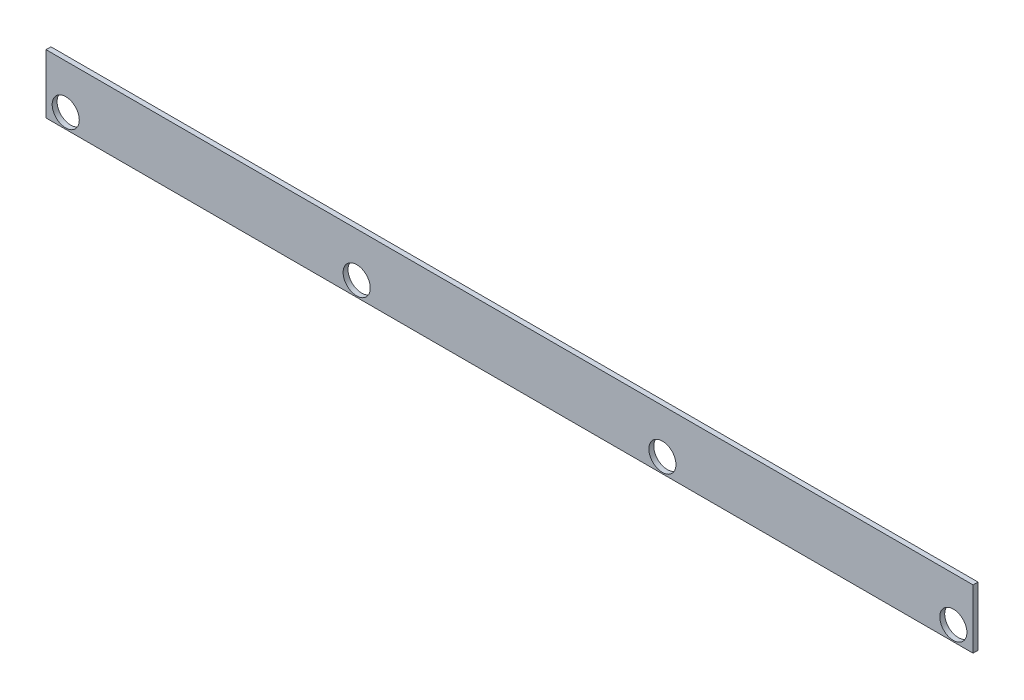
ISO-10303-21;
HEADER;
FILE_DESCRIPTION(('STEP AP214'),'2;1');
FILE_NAME('part.step','',(''),(''),'','','');
FILE_SCHEMA(('AUTOMOTIVE_DESIGN { 1 0 10303 214 1 1 1 1 }'));
ENDSEC;
DATA;
#1=APPLICATION_CONTEXT('core data for automotive mechanical design processes');
#2=APPLICATION_PROTOCOL_DEFINITION('international standard','automotive_design',2000,#1);
#3=PRODUCT_CONTEXT('',#1,'mechanical');
#4=PRODUCT('Part','Part','',(#3));
#5=PRODUCT_RELATED_PRODUCT_CATEGORY('part','',(#4));
#6=PRODUCT_DEFINITION_FORMATION('','',#4);
#7=PRODUCT_DEFINITION_CONTEXT('part definition',#1,'design');
#8=PRODUCT_DEFINITION('design','',#6,#7);
#9=PRODUCT_DEFINITION_SHAPE('','',#8);
#10=(LENGTH_UNIT() NAMED_UNIT(*) SI_UNIT(.MILLI.,.METRE.));
#11=(NAMED_UNIT(*) PLANE_ANGLE_UNIT() SI_UNIT($,.RADIAN.));
#12=(NAMED_UNIT(*) SI_UNIT($,.STERADIAN.) SOLID_ANGLE_UNIT());
#13=UNCERTAINTY_MEASURE_WITH_UNIT(LENGTH_MEASURE(1.E-05),#10,'distance_accuracy_value','');
#14=(GEOMETRIC_REPRESENTATION_CONTEXT(3) GLOBAL_UNCERTAINTY_ASSIGNED_CONTEXT((#13)) GLOBAL_UNIT_ASSIGNED_CONTEXT((#10,
#11,#12)) REPRESENTATION_CONTEXT('',''));
#15=CARTESIAN_POINT('',(0.,0.,0.));
#16=DIRECTION('',(0.,0.,1.));
#17=DIRECTION('',(1.,0.,0.));
#18=AXIS2_PLACEMENT_3D('',#15,#16,#17);
#19=CARTESIAN_POINT('',(0.,0.,1.));
#20=DIRECTION('',(0.,0.,1.));
#21=DIRECTION('',(1.,0.,0.));
#22=AXIS2_PLACEMENT_3D('',#19,#20,#21);
#23=PLANE('',#22);
#24=CARTESIAN_POINT('',(31.,-9.,1.));
#25=DIRECTION('',(0.,0.,1.));
#26=DIRECTION('',(1.,0.,0.));
#27=AXIS2_PLACEMENT_3D('',#24,#25,#26);
#28=CIRCLE('',#27,2.75);
#29=CARTESIAN_POINT('',(33.75,-9.,1.));
#30=VERTEX_POINT('',#29);
#31=EDGE_CURVE('E151',#30,#30,#28,.T.);
#32=ORIENTED_EDGE('',*,*,#31,.F.);
#33=EDGE_LOOP('',(#32));
#34=FACE_BOUND('',#33,.T.);
#35=CARTESIAN_POINT('',(-90.,-9.,1.));
#36=DIRECTION('',(0.,0.,1.));
#37=DIRECTION('',(1.,0.,0.));
#38=AXIS2_PLACEMENT_3D('',#35,#36,#37);
#39=CIRCLE('',#38,2.75);
#40=CARTESIAN_POINT('',(-87.25,-9.,1.));
#41=VERTEX_POINT('',#40);
#42=EDGE_CURVE('E119',#41,#41,#39,.T.);
#43=ORIENTED_EDGE('',*,*,#42,.F.);
#44=EDGE_LOOP('',(#43));
#45=FACE_BOUND('',#44,.T.);
#46=DIRECTION('',(0.,-1.,0.));
#47=VECTOR('',#46,1.);
#48=CARTESIAN_POINT('',(-94.,0.,1.));
#49=LINE('',#48,#47);
#50=CARTESIAN_POINT('',(-94.,0.,1.));
#51=VERTEX_POINT('',#50);
#52=CARTESIAN_POINT('',(-94.,-12.,1.));
#53=VERTEX_POINT('',#52);
#54=EDGE_CURVE('E98',#51,#53,#49,.T.);
#55=ORIENTED_EDGE('',*,*,#54,.T.);
#56=DIRECTION('',(1.,0.,0.));
#57=VECTOR('',#56,1.);
#58=CARTESIAN_POINT('',(-94.,-12.,1.));
#59=LINE('',#58,#57);
#60=CARTESIAN_POINT('',(94.,-12.,1.));
#61=VERTEX_POINT('',#60);
#62=EDGE_CURVE('E93',#53,#61,#59,.T.);
#63=ORIENTED_EDGE('',*,*,#62,.T.);
#64=DIRECTION('',(0.,1.,0.));
#65=VECTOR('',#64,1.);
#66=CARTESIAN_POINT('',(94.,-12.,1.));
#67=LINE('',#66,#65);
#68=CARTESIAN_POINT('',(94.,0.,1.));
#69=VERTEX_POINT('',#68);
#70=EDGE_CURVE('E96',#61,#69,#67,.T.);
#71=ORIENTED_EDGE('',*,*,#70,.T.);
#72=DIRECTION('',(-1.,0.,0.));
#73=VECTOR('',#72,1.);
#74=CARTESIAN_POINT('',(94.,0.,1.));
#75=LINE('',#74,#73);
#76=EDGE_CURVE('E63',#69,#51,#75,.T.);
#77=ORIENTED_EDGE('',*,*,#76,.T.);
#78=EDGE_LOOP('',(#55,#63,#71,#77));
#79=FACE_BOUND('',#78,.T.);
#80=CARTESIAN_POINT('',(-31.,-9.,1.));
#81=DIRECTION('',(0.,0.,1.));
#82=DIRECTION('',(1.,0.,0.));
#83=AXIS2_PLACEMENT_3D('',#80,#81,#82);
#84=CIRCLE('',#83,2.75);
#85=CARTESIAN_POINT('',(-28.25,-9.,1.));
#86=VERTEX_POINT('',#85);
#87=EDGE_CURVE('E143',#86,#86,#84,.T.);
#88=ORIENTED_EDGE('',*,*,#87,.F.);
#89=EDGE_LOOP('',(#88));
#90=FACE_BOUND('',#89,.T.);
#91=CARTESIAN_POINT('',(90.,-9.,1.));
#92=DIRECTION('',(0.,0.,1.));
#93=DIRECTION('',(1.,0.,0.));
#94=AXIS2_PLACEMENT_3D('',#91,#92,#93);
#95=CIRCLE('',#94,2.75);
#96=CARTESIAN_POINT('',(92.75,-9.,1.));
#97=VERTEX_POINT('',#96);
#98=EDGE_CURVE('E159',#97,#97,#95,.T.);
#99=ORIENTED_EDGE('',*,*,#98,.F.);
#100=EDGE_LOOP('',(#99));
#101=FACE_BOUND('',#100,.T.);
#102=ADVANCED_FACE('F45',(#34,#45,#79,#90,#101),#23,.T.);
#103=CARTESIAN_POINT('',(0.,0.,0.));
#104=DIRECTION('',(0.,0.,1.));
#105=DIRECTION('',(1.,0.,0.));
#106=AXIS2_PLACEMENT_3D('',#103,#104,#105);
#107=PLANE('',#106);
#108=DIRECTION('',(0.,-1.,0.));
#109=VECTOR('',#108,1.);
#110=CARTESIAN_POINT('',(-94.,0.,0.));
#111=LINE('',#110,#109);
#112=CARTESIAN_POINT('',(-94.,0.,0.));
#113=VERTEX_POINT('',#112);
#114=CARTESIAN_POINT('',(-94.,-12.,0.));
#115=VERTEX_POINT('',#114);
#116=EDGE_CURVE('E115',#113,#115,#111,.T.);
#117=ORIENTED_EDGE('',*,*,#116,.F.);
#118=DIRECTION('',(-1.,0.,0.));
#119=VECTOR('',#118,1.);
#120=CARTESIAN_POINT('',(94.,0.,0.));
#121=LINE('',#120,#119);
#122=CARTESIAN_POINT('',(94.,0.,0.));
#123=VERTEX_POINT('',#122);
#124=EDGE_CURVE('E86',#123,#113,#121,.T.);
#125=ORIENTED_EDGE('',*,*,#124,.F.);
#126=DIRECTION('',(0.,1.,0.));
#127=VECTOR('',#126,1.);
#128=CARTESIAN_POINT('',(94.,-12.,0.));
#129=LINE('',#128,#127);
#130=CARTESIAN_POINT('',(94.,-12.,0.));
#131=VERTEX_POINT('',#130);
#132=EDGE_CURVE('E80',#131,#123,#129,.T.);
#133=ORIENTED_EDGE('',*,*,#132,.F.);
#134=DIRECTION('',(1.,0.,0.));
#135=VECTOR('',#134,1.);
#136=CARTESIAN_POINT('',(-94.,-12.,0.));
#137=LINE('',#136,#135);
#138=EDGE_CURVE('E103',#115,#131,#137,.T.);
#139=ORIENTED_EDGE('',*,*,#138,.F.);
#140=EDGE_LOOP('',(#117,#125,#133,#139));
#141=FACE_BOUND('',#140,.T.);
#142=CARTESIAN_POINT('',(-90.,-9.,0.));
#143=DIRECTION('',(0.,0.,1.));
#144=DIRECTION('',(1.,0.,0.));
#145=AXIS2_PLACEMENT_3D('',#142,#143,#144);
#146=CIRCLE('',#145,2.75);
#147=CARTESIAN_POINT('',(-87.25,-9.,0.));
#148=VERTEX_POINT('',#147);
#149=EDGE_CURVE('E139',#148,#148,#146,.T.);
#150=ORIENTED_EDGE('',*,*,#149,.T.);
#151=EDGE_LOOP('',(#150));
#152=FACE_BOUND('',#151,.T.);
#153=CARTESIAN_POINT('',(-31.,-9.,0.));
#154=DIRECTION('',(0.,0.,1.));
#155=DIRECTION('',(1.,0.,0.));
#156=AXIS2_PLACEMENT_3D('',#153,#154,#155);
#157=CIRCLE('',#156,2.75);
#158=CARTESIAN_POINT('',(-28.25,-9.,0.));
#159=VERTEX_POINT('',#158);
#160=EDGE_CURVE('E147',#159,#159,#157,.T.);
#161=ORIENTED_EDGE('',*,*,#160,.T.);
#162=EDGE_LOOP('',(#161));
#163=FACE_BOUND('',#162,.T.);
#164=CARTESIAN_POINT('',(31.,-9.,0.));
#165=DIRECTION('',(0.,0.,1.));
#166=DIRECTION('',(1.,0.,0.));
#167=AXIS2_PLACEMENT_3D('',#164,#165,#166);
#168=CIRCLE('',#167,2.75);
#169=CARTESIAN_POINT('',(33.75,-9.,0.));
#170=VERTEX_POINT('',#169);
#171=EDGE_CURVE('E155',#170,#170,#168,.T.);
#172=ORIENTED_EDGE('',*,*,#171,.T.);
#173=EDGE_LOOP('',(#172));
#174=FACE_BOUND('',#173,.T.);
#175=CARTESIAN_POINT('',(90.,-9.,0.));
#176=DIRECTION('',(0.,0.,1.));
#177=DIRECTION('',(1.,0.,0.));
#178=AXIS2_PLACEMENT_3D('',#175,#176,#177);
#179=CIRCLE('',#178,2.75);
#180=CARTESIAN_POINT('',(92.75,-9.,0.));
#181=VERTEX_POINT('',#180);
#182=EDGE_CURVE('E162',#181,#181,#179,.T.);
#183=ORIENTED_EDGE('',*,*,#182,.T.);
#184=EDGE_LOOP('',(#183));
#185=FACE_BOUND('',#184,.T.);
#186=ADVANCED_FACE('F132',(#141,#152,#163,#174,#185),#107,.F.);
#187=CARTESIAN_POINT('',(-94.,0.,1.));
#188=DIRECTION('',(1.,0.,0.));
#189=DIRECTION('',(0.,0.,-1.));
#190=AXIS2_PLACEMENT_3D('',#187,#188,#189);
#191=PLANE('',#190);
#192=ORIENTED_EDGE('',*,*,#116,.T.);
#193=DIRECTION('',(0.,0.,-1.));
#194=VECTOR('',#193,1.);
#195=CARTESIAN_POINT('',(-94.,-12.,1.));
#196=LINE('',#195,#194);
#197=EDGE_CURVE('E11',#53,#115,#196,.T.);
#198=ORIENTED_EDGE('',*,*,#197,.F.);
#199=ORIENTED_EDGE('',*,*,#54,.F.);
#200=DIRECTION('',(0.,0.,-1.));
#201=VECTOR('',#200,1.);
#202=CARTESIAN_POINT('',(-94.,0.,1.));
#203=LINE('',#202,#201);
#204=EDGE_CURVE('E111',#51,#113,#203,.T.);
#205=ORIENTED_EDGE('',*,*,#204,.T.);
#206=EDGE_LOOP('',(#192,#198,#199,#205));
#207=FACE_BOUND('',#206,.T.);
#208=ADVANCED_FACE('F47',(#207),#191,.F.);
#209=CARTESIAN_POINT('',(-94.,-12.,1.));
#210=DIRECTION('',(0.,1.,0.));
#211=DIRECTION('',(0.,0.,1.));
#212=AXIS2_PLACEMENT_3D('',#209,#210,#211);
#213=PLANE('',#212);
#214=ORIENTED_EDGE('',*,*,#138,.T.);
#215=DIRECTION('',(0.,0.,-1.));
#216=VECTOR('',#215,1.);
#217=CARTESIAN_POINT('',(94.,-12.,1.));
#218=LINE('',#217,#216);
#219=EDGE_CURVE('E55',#61,#131,#218,.T.);
#220=ORIENTED_EDGE('',*,*,#219,.F.);
#221=ORIENTED_EDGE('',*,*,#62,.F.);
#222=ORIENTED_EDGE('',*,*,#197,.T.);
#223=EDGE_LOOP('',(#214,#220,#221,#222));
#224=FACE_BOUND('',#223,.T.);
#225=ADVANCED_FACE('F102',(#224),#213,.F.);
#226=CARTESIAN_POINT('',(94.,-12.,1.));
#227=DIRECTION('',(-1.,0.,0.));
#228=DIRECTION('',(0.,0.,1.));
#229=AXIS2_PLACEMENT_3D('',#226,#227,#228);
#230=PLANE('',#229);
#231=ORIENTED_EDGE('',*,*,#132,.T.);
#232=DIRECTION('',(0.,0.,-1.));
#233=VECTOR('',#232,1.);
#234=CARTESIAN_POINT('',(94.,0.,1.));
#235=LINE('',#234,#233);
#236=EDGE_CURVE('E105',#69,#123,#235,.T.);
#237=ORIENTED_EDGE('',*,*,#236,.F.);
#238=ORIENTED_EDGE('',*,*,#70,.F.);
#239=ORIENTED_EDGE('',*,*,#219,.T.);
#240=EDGE_LOOP('',(#231,#237,#238,#239));
#241=FACE_BOUND('',#240,.T.);
#242=ADVANCED_FACE('F106',(#241),#230,.F.);
#243=CARTESIAN_POINT('',(94.,0.,1.));
#244=DIRECTION('',(0.,-1.,0.));
#245=DIRECTION('',(0.,0.,-1.));
#246=AXIS2_PLACEMENT_3D('',#243,#244,#245);
#247=PLANE('',#246);
#248=ORIENTED_EDGE('',*,*,#124,.T.);
#249=ORIENTED_EDGE('',*,*,#204,.F.);
#250=ORIENTED_EDGE('',*,*,#76,.F.);
#251=ORIENTED_EDGE('',*,*,#236,.T.);
#252=EDGE_LOOP('',(#248,#249,#250,#251));
#253=FACE_BOUND('',#252,.T.);
#254=ADVANCED_FACE('F129',(#253),#247,.F.);
#255=CARTESIAN_POINT('',(-90.,-9.,1.));
#256=DIRECTION('',(0.,0.,-1.));
#257=DIRECTION('',(-1.,0.,0.));
#258=AXIS2_PLACEMENT_3D('',#255,#256,#257);
#259=CYLINDRICAL_SURFACE('',#258,2.75);
#260=ORIENTED_EDGE('',*,*,#42,.T.);
#261=EDGE_LOOP('',(#260));
#262=FACE_BOUND('',#261,.T.);
#263=ORIENTED_EDGE('',*,*,#149,.F.);
#264=EDGE_LOOP('',(#263));
#265=FACE_BOUND('',#264,.T.);
#266=ADVANCED_FACE('F180',(#262,#265),#259,.F.);
#267=CARTESIAN_POINT('',(-31.,-9.,1.));
#268=DIRECTION('',(0.,0.,-1.));
#269=DIRECTION('',(-1.,0.,0.));
#270=AXIS2_PLACEMENT_3D('',#267,#268,#269);
#271=CYLINDRICAL_SURFACE('',#270,2.75);
#272=ORIENTED_EDGE('',*,*,#87,.T.);
#273=EDGE_LOOP('',(#272));
#274=FACE_BOUND('',#273,.T.);
#275=ORIENTED_EDGE('',*,*,#160,.F.);
#276=EDGE_LOOP('',(#275));
#277=FACE_BOUND('',#276,.T.);
#278=ADVANCED_FACE('F231',(#274,#277),#271,.F.);
#279=CARTESIAN_POINT('',(31.,-9.,1.));
#280=DIRECTION('',(0.,0.,-1.));
#281=DIRECTION('',(-1.,0.,0.));
#282=AXIS2_PLACEMENT_3D('',#279,#280,#281);
#283=CYLINDRICAL_SURFACE('',#282,2.75);
#284=ORIENTED_EDGE('',*,*,#31,.T.);
#285=EDGE_LOOP('',(#284));
#286=FACE_BOUND('',#285,.T.);
#287=ORIENTED_EDGE('',*,*,#171,.F.);
#288=EDGE_LOOP('',(#287));
#289=FACE_BOUND('',#288,.T.);
#290=ADVANCED_FACE('F240',(#286,#289),#283,.F.);
#291=CARTESIAN_POINT('',(90.,-9.,1.));
#292=DIRECTION('',(0.,0.,-1.));
#293=DIRECTION('',(-1.,0.,0.));
#294=AXIS2_PLACEMENT_3D('',#291,#292,#293);
#295=CYLINDRICAL_SURFACE('',#294,2.75);
#296=ORIENTED_EDGE('',*,*,#98,.T.);
#297=EDGE_LOOP('',(#296));
#298=FACE_BOUND('',#297,.T.);
#299=ORIENTED_EDGE('',*,*,#182,.F.);
#300=EDGE_LOOP('',(#299));
#301=FACE_BOUND('',#300,.T.);
#302=ADVANCED_FACE('F168',(#298,#301),#295,.F.);
#303=CLOSED_SHELL('',(#102,#186,#208,#225,#242,#254,#266,#278,#290,#302));
#304=MANIFOLD_SOLID_BREP('B2',#303);
#305=ADVANCED_BREP_SHAPE_REPRESENTATION('',(#18,#304),#14);
#306=SHAPE_DEFINITION_REPRESENTATION(#9,#305);
ENDSEC;
END-ISO-10303-21;
